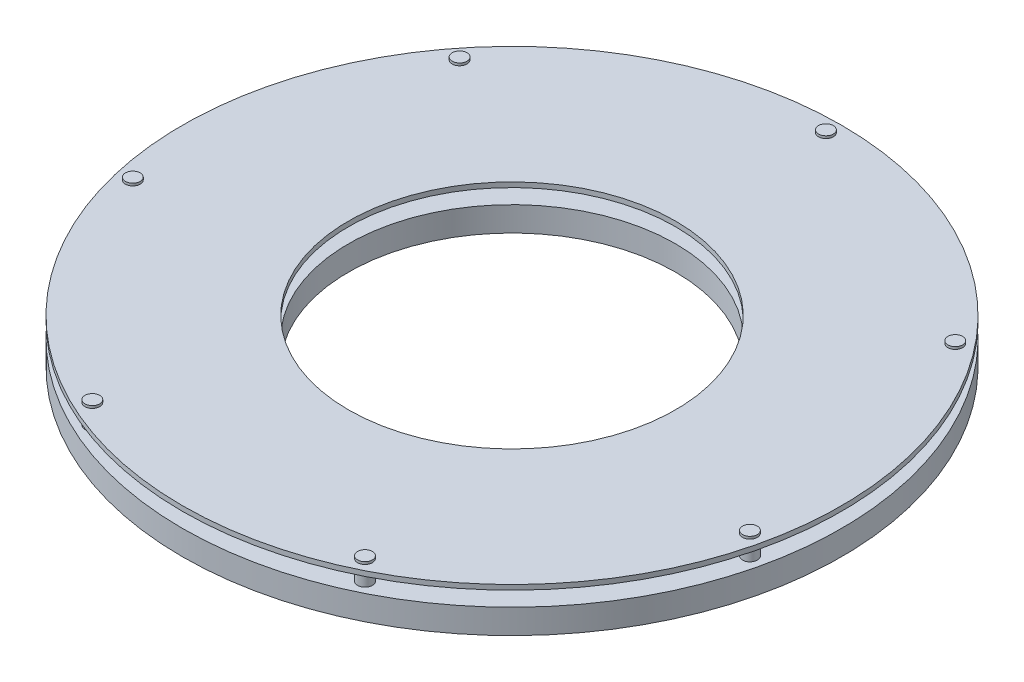
ISO-10303-21;
HEADER;
FILE_DESCRIPTION(('STEP AP214'),'2;1');
FILE_NAME('part.step','',(''),(''),'','','');
FILE_SCHEMA(('AUTOMOTIVE_DESIGN { 1 0 10303 214 1 1 1 1 }'));
ENDSEC;
DATA;
#1=APPLICATION_CONTEXT('core data for automotive mechanical design processes');
#2=APPLICATION_PROTOCOL_DEFINITION('international standard','automotive_design',2000,#1);
#3=PRODUCT_CONTEXT('',#1,'mechanical');
#4=PRODUCT('Part','Part','',(#3));
#5=PRODUCT_RELATED_PRODUCT_CATEGORY('part','',(#4));
#6=PRODUCT_DEFINITION_FORMATION('','',#4);
#7=PRODUCT_DEFINITION_CONTEXT('part definition',#1,'design');
#8=PRODUCT_DEFINITION('design','',#6,#7);
#9=PRODUCT_DEFINITION_SHAPE('','',#8);
#10=(LENGTH_UNIT() NAMED_UNIT(*) SI_UNIT(.MILLI.,.METRE.));
#11=(NAMED_UNIT(*) PLANE_ANGLE_UNIT() SI_UNIT($,.RADIAN.));
#12=(NAMED_UNIT(*) SI_UNIT($,.STERADIAN.) SOLID_ANGLE_UNIT());
#13=UNCERTAINTY_MEASURE_WITH_UNIT(LENGTH_MEASURE(1.E-05),#10,'distance_accuracy_value','');
#14=(GEOMETRIC_REPRESENTATION_CONTEXT(3) GLOBAL_UNCERTAINTY_ASSIGNED_CONTEXT((#13)) GLOBAL_UNIT_ASSIGNED_CONTEXT((#10,
#11,#12)) REPRESENTATION_CONTEXT('',''));
#15=CARTESIAN_POINT('',(0.,0.,0.));
#16=DIRECTION('',(0.,0.,1.));
#17=DIRECTION('',(1.,0.,0.));
#18=AXIS2_PLACEMENT_3D('',#15,#16,#17);
#19=CARTESIAN_POINT('',(0.,840.,-1425.));
#20=DIRECTION('',(0.,1.,0.));
#21=DIRECTION('',(0.,0.,1.));
#22=AXIS2_PLACEMENT_3D('',#19,#20,#21);
#23=PLANE('',#22);
#24=CARTESIAN_POINT('',(-273.430562276835,840.,-845.24425176375));
#25=DIRECTION('',(0.,1.,0.));
#26=DIRECTION('',(0.,0.,1.));
#27=AXIS2_PLACEMENT_3D('',#24,#25,#26);
#28=CIRCLE('',#27,15.);
#29=CARTESIAN_POINT('',(-273.430562276835,840.,-830.24425176375));
#30=VERTEX_POINT('',#29);
#31=EDGE_CURVE('E56',#30,#30,#28,.T.);
#32=ORIENTED_EDGE('',*,*,#31,.T.);
#33=EDGE_LOOP('',(#32));
#34=FACE_BOUND('',#33,.T.);
#35=CARTESIAN_POINT('',(-623.936104673147,840.,-1278.08254941873));
#36=DIRECTION('',(0.,1.,0.));
#37=DIRECTION('',(0.,0.,1.));
#38=AXIS2_PLACEMENT_3D('',#35,#36,#37);
#39=CIRCLE('',#38,15.);
#40=CARTESIAN_POINT('',(-623.936104673147,840.,-1263.08254941873));
#41=VERTEX_POINT('',#40);
#42=EDGE_CURVE('E65',#41,#41,#39,.T.);
#43=ORIENTED_EDGE('',*,*,#42,.T.);
#44=EDGE_LOOP('',(#43));
#45=FACE_BOUND('',#44,.T.);
#46=CARTESIAN_POINT('',(-503.388152694557,840.,-1821.83922150761));
#47=DIRECTION('',(0.,1.,0.));
#48=DIRECTION('',(0.,0.,1.));
#49=AXIS2_PLACEMENT_3D('',#46,#47,#48);
#50=CIRCLE('',#49,15.);
#51=CARTESIAN_POINT('',(-503.388152694557,840.,-1806.83922150761));
#52=VERTEX_POINT('',#51);
#53=EDGE_CURVE('E74',#52,#52,#50,.T.);
#54=ORIENTED_EDGE('',*,*,#53,.T.);
#55=EDGE_LOOP('',(#54));
#56=FACE_BOUND('',#55,.T.);
#57=CARTESIAN_POINT('',(-2.79688125152255,840.,-2065.99389814199));
#58=DIRECTION('',(0.,1.,0.));
#59=DIRECTION('',(0.,0.,1.));
#60=AXIS2_PLACEMENT_3D('',#57,#58,#59);
#61=CIRCLE('',#60,15.);
#62=CARTESIAN_POINT('',(-2.79688125152255,840.,-2050.99389814199));
#63=VERTEX_POINT('',#62);
#64=EDGE_CURVE('E83',#63,#63,#61,.T.);
#65=ORIENTED_EDGE('',*,*,#64,.T.);
#66=EDGE_LOOP('',(#65));
#67=FACE_BOUND('',#66,.T.);
#68=CARTESIAN_POINT('',(499.905953662537,840.,-1826.21694566998));
#69=DIRECTION('',(0.,1.,0.));
#70=DIRECTION('',(0.,0.,1.));
#71=AXIS2_PLACEMENT_3D('',#68,#69,#70);
#72=CIRCLE('',#71,15.);
#73=CARTESIAN_POINT('',(499.905953662537,840.,-1811.21694566998));
#74=VERTEX_POINT('',#73);
#75=EDGE_CURVE('E92',#74,#74,#72,.T.);
#76=ORIENTED_EDGE('',*,*,#75,.T.);
#77=EDGE_LOOP('',(#76));
#78=FACE_BOUND('',#77,.T.);
#79=CARTESIAN_POINT('',(625.194427445957,840.,-1283.53294415122));
#80=DIRECTION('',(0.,1.,0.));
#81=DIRECTION('',(0.,0.,1.));
#82=AXIS2_PLACEMENT_3D('',#79,#80,#81);
#83=CIRCLE('',#82,15.);
#84=CARTESIAN_POINT('',(625.194427445957,840.,-1268.53294415122));
#85=VERTEX_POINT('',#84);
#86=EDGE_CURVE('E101',#85,#85,#83,.T.);
#87=ORIENTED_EDGE('',*,*,#86,.T.);
#88=EDGE_LOOP('',(#87));
#89=FACE_BOUND('',#88,.T.);
#90=CARTESIAN_POINT('',(278.479409996231,840.,-847.652428594221));
#91=DIRECTION('',(0.,1.,0.));
#92=DIRECTION('',(0.,0.,1.));
#93=AXIS2_PLACEMENT_3D('',#90,#91,#92);
#94=CIRCLE('',#93,15.);
#95=CARTESIAN_POINT('',(278.479409996231,840.,-832.652428594221));
#96=VERTEX_POINT('',#95);
#97=EDGE_CURVE('E110',#96,#96,#94,.T.);
#98=ORIENTED_EDGE('',*,*,#97,.T.);
#99=EDGE_LOOP('',(#98));
#100=FACE_BOUND('',#99,.T.);
#101=CARTESIAN_POINT('',(0.,840.,-1425.));
#102=DIRECTION('',(0.,1.,0.));
#103=DIRECTION('',(0.,0.,1.));
#104=AXIS2_PLACEMENT_3D('',#101,#102,#103);
#105=CIRCLE('',#104,670.);
#106=CARTESIAN_POINT('',(-1.23072938559149E-13,840.,-755.));
#107=VERTEX_POINT('',#106);
#108=EDGE_CURVE('E120',#107,#107,#105,.T.);
#109=ORIENTED_EDGE('',*,*,#108,.F.);
#110=EDGE_LOOP('',(#109));
#111=FACE_BOUND('',#110,.T.);
#112=CARTESIAN_POINT('',(0.,840.,-1425.));
#113=DIRECTION('',(0.,1.,0.));
#114=DIRECTION('',(0.,0.,1.));
#115=AXIS2_PLACEMENT_3D('',#112,#113,#114);
#116=CIRCLE('',#115,332.5);
#117=CARTESIAN_POINT('',(0.,840.,-1092.5));
#118=VERTEX_POINT('',#117);
#119=EDGE_CURVE('E114',#118,#118,#116,.F.);
#120=ORIENTED_EDGE('',*,*,#119,.F.);
#121=EDGE_LOOP('',(#120));
#122=FACE_BOUND('',#121,.T.);
#123=ADVANCED_FACE('F15',(#34,#45,#56,#67,#78,#89,#100,#111,#122),#23,.F.);
#124=CARTESIAN_POINT('',(0.,850.,-1425.));
#125=DIRECTION('',(0.,1.,0.));
#126=DIRECTION('',(0.,0.,1.));
#127=AXIS2_PLACEMENT_3D('',#124,#125,#126);
#128=PLANE('',#127);
#129=CARTESIAN_POINT('',(-273.430562276835,850.,-845.24425176375));
#130=DIRECTION('',(0.,1.,0.));
#131=DIRECTION('',(0.,0.,1.));
#132=AXIS2_PLACEMENT_3D('',#129,#130,#131);
#133=CIRCLE('',#132,15.);
#134=CARTESIAN_POINT('',(-273.430562276835,850.,-830.24425176375));
#135=VERTEX_POINT('',#134);
#136=EDGE_CURVE('E143',#135,#135,#133,.T.);
#137=ORIENTED_EDGE('',*,*,#136,.F.);
#138=EDGE_LOOP('',(#137));
#139=FACE_BOUND('',#138,.T.);
#140=CARTESIAN_POINT('',(-623.936104673147,850.,-1278.08254941873));
#141=DIRECTION('',(0.,1.,0.));
#142=DIRECTION('',(0.,0.,1.));
#143=AXIS2_PLACEMENT_3D('',#140,#141,#142);
#144=CIRCLE('',#143,15.);
#145=CARTESIAN_POINT('',(-623.936104673147,850.,-1263.08254941873));
#146=VERTEX_POINT('',#145);
#147=EDGE_CURVE('E140',#146,#146,#144,.T.);
#148=ORIENTED_EDGE('',*,*,#147,.F.);
#149=EDGE_LOOP('',(#148));
#150=FACE_BOUND('',#149,.T.);
#151=CARTESIAN_POINT('',(-503.388152694557,850.,-1821.83922150761));
#152=DIRECTION('',(0.,1.,0.));
#153=DIRECTION('',(0.,0.,1.));
#154=AXIS2_PLACEMENT_3D('',#151,#152,#153);
#155=CIRCLE('',#154,15.);
#156=CARTESIAN_POINT('',(-503.388152694557,850.,-1806.83922150761));
#157=VERTEX_POINT('',#156);
#158=EDGE_CURVE('E137',#157,#157,#155,.T.);
#159=ORIENTED_EDGE('',*,*,#158,.F.);
#160=EDGE_LOOP('',(#159));
#161=FACE_BOUND('',#160,.T.);
#162=CARTESIAN_POINT('',(-2.79688125152254,850.,-2065.99389814199));
#163=DIRECTION('',(0.,1.,0.));
#164=DIRECTION('',(0.,0.,1.));
#165=AXIS2_PLACEMENT_3D('',#162,#163,#164);
#166=CIRCLE('',#165,15.);
#167=CARTESIAN_POINT('',(-2.79688125152254,850.,-2050.99389814199));
#168=VERTEX_POINT('',#167);
#169=EDGE_CURVE('E134',#168,#168,#166,.T.);
#170=ORIENTED_EDGE('',*,*,#169,.F.);
#171=EDGE_LOOP('',(#170));
#172=FACE_BOUND('',#171,.T.);
#173=CARTESIAN_POINT('',(499.905953662537,850.,-1826.21694566998));
#174=DIRECTION('',(0.,1.,0.));
#175=DIRECTION('',(0.,0.,1.));
#176=AXIS2_PLACEMENT_3D('',#173,#174,#175);
#177=CIRCLE('',#176,15.);
#178=CARTESIAN_POINT('',(499.905953662537,850.,-1811.21694566998));
#179=VERTEX_POINT('',#178);
#180=EDGE_CURVE('E131',#179,#179,#177,.T.);
#181=ORIENTED_EDGE('',*,*,#180,.F.);
#182=EDGE_LOOP('',(#181));
#183=FACE_BOUND('',#182,.T.);
#184=CARTESIAN_POINT('',(625.194427445957,850.,-1283.53294415122));
#185=DIRECTION('',(0.,1.,0.));
#186=DIRECTION('',(0.,0.,1.));
#187=AXIS2_PLACEMENT_3D('',#184,#185,#186);
#188=CIRCLE('',#187,15.);
#189=CARTESIAN_POINT('',(625.194427445957,850.,-1268.53294415122));
#190=VERTEX_POINT('',#189);
#191=EDGE_CURVE('E128',#190,#190,#188,.T.);
#192=ORIENTED_EDGE('',*,*,#191,.F.);
#193=EDGE_LOOP('',(#192));
#194=FACE_BOUND('',#193,.T.);
#195=CARTESIAN_POINT('',(278.479409996231,850.,-847.652428594221));
#196=DIRECTION('',(0.,1.,0.));
#197=DIRECTION('',(0.,0.,1.));
#198=AXIS2_PLACEMENT_3D('',#195,#196,#197);
#199=CIRCLE('',#198,15.);
#200=CARTESIAN_POINT('',(278.479409996231,850.,-832.652428594221));
#201=VERTEX_POINT('',#200);
#202=EDGE_CURVE('E123',#201,#201,#199,.T.);
#203=ORIENTED_EDGE('',*,*,#202,.F.);
#204=EDGE_LOOP('',(#203));
#205=FACE_BOUND('',#204,.T.);
#206=CARTESIAN_POINT('',(0.,850.,-1425.));
#207=DIRECTION('',(0.,1.,0.));
#208=DIRECTION('',(0.,0.,1.));
#209=AXIS2_PLACEMENT_3D('',#206,#207,#208);
#210=CIRCLE('',#209,670.);
#211=CARTESIAN_POINT('',(-1.23072938559149E-13,850.,-755.));
#212=VERTEX_POINT('',#211);
#213=EDGE_CURVE('E117',#212,#212,#210,.T.);
#214=ORIENTED_EDGE('',*,*,#213,.T.);
#215=EDGE_LOOP('',(#214));
#216=FACE_BOUND('',#215,.T.);
#217=CARTESIAN_POINT('',(0.,850.,-1425.));
#218=DIRECTION('',(0.,1.,0.));
#219=DIRECTION('',(0.,0.,1.));
#220=AXIS2_PLACEMENT_3D('',#217,#218,#219);
#221=CIRCLE('',#220,332.5);
#222=CARTESIAN_POINT('',(0.,850.,-1092.5));
#223=VERTEX_POINT('',#222);
#224=EDGE_CURVE('E113',#223,#223,#221,.F.);
#225=ORIENTED_EDGE('',*,*,#224,.T.);
#226=EDGE_LOOP('',(#225));
#227=FACE_BOUND('',#226,.T.);
#228=ADVANCED_FACE('F180',(#139,#150,#161,#172,#183,#194,#205,#216,#227),#128,.T.);
#229=CARTESIAN_POINT('',(0.,840.,-1425.));
#230=DIRECTION('',(0.,1.,0.));
#231=DIRECTION('',(0.,0.,1.));
#232=AXIS2_PLACEMENT_3D('',#229,#230,#231);
#233=CYLINDRICAL_SURFACE('',#232,670.);
#234=ORIENTED_EDGE('',*,*,#108,.T.);
#235=EDGE_LOOP('',(#234));
#236=FACE_BOUND('',#235,.T.);
#237=ORIENTED_EDGE('',*,*,#213,.F.);
#238=EDGE_LOOP('',(#237));
#239=FACE_BOUND('',#238,.T.);
#240=ADVANCED_FACE('F17',(#236,#239),#233,.T.);
#241=CARTESIAN_POINT('',(0.,4640.14511595532,-1425.));
#242=DIRECTION('',(0.,-1.,0.));
#243=DIRECTION('',(0.,0.,-1.));
#244=AXIS2_PLACEMENT_3D('',#241,#242,#243);
#245=CYLINDRICAL_SURFACE('',#244,332.5);
#246=ORIENTED_EDGE('',*,*,#224,.F.);
#247=EDGE_LOOP('',(#246));
#248=FACE_BOUND('',#247,.T.);
#249=ORIENTED_EDGE('',*,*,#119,.T.);
#250=EDGE_LOOP('',(#249));
#251=FACE_BOUND('',#250,.T.);
#252=ADVANCED_FACE('F190',(#248,#251),#245,.F.);
#253=CARTESIAN_POINT('',(278.479409996231,855.,-847.652428594221));
#254=DIRECTION('',(0.,1.,0.));
#255=DIRECTION('',(0.,0.,1.));
#256=AXIS2_PLACEMENT_3D('',#253,#254,#255);
#257=PLANE('',#256);
#258=CARTESIAN_POINT('',(278.479409996231,855.,-847.652428594221));
#259=DIRECTION('',(0.,1.,0.));
#260=DIRECTION('',(0.,0.,1.));
#261=AXIS2_PLACEMENT_3D('',#258,#259,#260);
#262=CIRCLE('',#261,15.);
#263=CARTESIAN_POINT('',(278.479409996231,855.,-832.652428594221));
#264=VERTEX_POINT('',#263);
#265=EDGE_CURVE('E104',#264,#264,#262,.T.);
#266=ORIENTED_EDGE('',*,*,#265,.T.);
#267=EDGE_LOOP('',(#266));
#268=FACE_BOUND('',#267,.T.);
#269=ADVANCED_FACE('F192',(#268),#257,.T.);
#270=CARTESIAN_POINT('',(278.479409996231,755.,-847.652428594221));
#271=DIRECTION('',(0.,1.,0.));
#272=DIRECTION('',(0.,0.,1.));
#273=AXIS2_PLACEMENT_3D('',#270,#271,#272);
#274=CYLINDRICAL_SURFACE('',#273,15.);
#275=ORIENTED_EDGE('',*,*,#202,.T.);
#276=EDGE_LOOP('',(#275));
#277=FACE_BOUND('',#276,.T.);
#278=ORIENTED_EDGE('',*,*,#265,.F.);
#279=EDGE_LOOP('',(#278));
#280=FACE_BOUND('',#279,.T.);
#281=ADVANCED_FACE('F200',(#277,#280),#274,.T.);
#282=CARTESIAN_POINT('',(278.479409996231,810.,-847.652428594221));
#283=DIRECTION('',(0.,1.,0.));
#284=DIRECTION('',(0.,0.,1.));
#285=AXIS2_PLACEMENT_3D('',#282,#283,#284);
#286=CIRCLE('',#285,15.);
#287=CARTESIAN_POINT('',(278.479409996231,810.,-832.652428594221));
#288=VERTEX_POINT('',#287);
#289=EDGE_CURVE('E10',#288,#288,#286,.F.);
#290=ORIENTED_EDGE('',*,*,#289,.F.);
#291=EDGE_LOOP('',(#290));
#292=FACE_BOUND('',#291,.T.);
#293=ORIENTED_EDGE('',*,*,#97,.F.);
#294=EDGE_LOOP('',(#293));
#295=FACE_BOUND('',#294,.T.);
#296=ADVANCED_FACE('F232',(#292,#295),#274,.T.);
#297=CARTESIAN_POINT('',(625.194427445957,855.,-1283.53294415122));
#298=DIRECTION('',(0.,1.,0.));
#299=DIRECTION('',(0.782608156852414,0.,0.62251463663762));
#300=AXIS2_PLACEMENT_3D('',#297,#298,#299);
#301=PLANE('',#300);
#302=CARTESIAN_POINT('',(625.194427445957,855.,-1283.53294415122));
#303=DIRECTION('',(0.,1.,0.));
#304=DIRECTION('',(0.782608156852414,0.,0.62251463663762));
#305=AXIS2_PLACEMENT_3D('',#302,#303,#304);
#306=CIRCLE('',#305,15.);
#307=CARTESIAN_POINT('',(636.933549798743,855.,-1274.19522460165));
#308=VERTEX_POINT('',#307);
#309=EDGE_CURVE('E95',#308,#308,#306,.T.);
#310=ORIENTED_EDGE('',*,*,#309,.T.);
#311=EDGE_LOOP('',(#310));
#312=FACE_BOUND('',#311,.T.);
#313=ADVANCED_FACE('F238',(#312),#301,.T.);
#314=CARTESIAN_POINT('',(625.194427445957,755.,-1283.53294415122));
#315=DIRECTION('',(0.,1.,0.));
#316=DIRECTION('',(0.782608156852414,0.,0.62251463663762));
#317=AXIS2_PLACEMENT_3D('',#314,#315,#316);
#318=CYLINDRICAL_SURFACE('',#317,15.);
#319=ORIENTED_EDGE('',*,*,#191,.T.);
#320=EDGE_LOOP('',(#319));
#321=FACE_BOUND('',#320,.T.);
#322=ORIENTED_EDGE('',*,*,#309,.F.);
#323=EDGE_LOOP('',(#322));
#324=FACE_BOUND('',#323,.T.);
#325=ADVANCED_FACE('F450',(#321,#324),#318,.T.);
#326=CARTESIAN_POINT('',(625.194427445957,810.,-1283.53294415122));
#327=DIRECTION('',(0.,1.,0.));
#328=DIRECTION('',(0.,0.,1.));
#329=AXIS2_PLACEMENT_3D('',#326,#327,#328);
#330=CIRCLE('',#329,15.);
#331=CARTESIAN_POINT('',(625.194427445957,810.,-1268.53294415122));
#332=VERTEX_POINT('',#331);
#333=EDGE_CURVE('E23',#332,#332,#330,.F.);
#334=ORIENTED_EDGE('',*,*,#333,.F.);
#335=EDGE_LOOP('',(#334));
#336=FACE_BOUND('',#335,.T.);
#337=ORIENTED_EDGE('',*,*,#86,.F.);
#338=EDGE_LOOP('',(#337));
#339=FACE_BOUND('',#338,.T.);
#340=ADVANCED_FACE('F449',(#336,#339),#318,.T.);
#341=CARTESIAN_POINT('',(499.905953662537,855.,-1826.21694566998));
#342=DIRECTION('',(0.,1.,0.));
#343=DIRECTION('',(0.974370064785235,0.,-0.224951054343865));
#344=AXIS2_PLACEMENT_3D('',#341,#342,#343);
#345=PLANE('',#344);
#346=CARTESIAN_POINT('',(499.905953662537,855.,-1826.21694566998));
#347=DIRECTION('',(0.,1.,0.));
#348=DIRECTION('',(0.974370064785235,0.,-0.224951054343865));
#349=AXIS2_PLACEMENT_3D('',#346,#347,#348);
#350=CIRCLE('',#349,15.);
#351=CARTESIAN_POINT('',(514.521504634316,855.,-1829.59121148514));
#352=VERTEX_POINT('',#351);
#353=EDGE_CURVE('E86',#352,#352,#350,.T.);
#354=ORIENTED_EDGE('',*,*,#353,.T.);
#355=EDGE_LOOP('',(#354));
#356=FACE_BOUND('',#355,.T.);
#357=ADVANCED_FACE('F465',(#356),#345,.T.);
#358=CARTESIAN_POINT('',(499.905953662537,755.,-1826.21694566998));
#359=DIRECTION('',(0.,1.,0.));
#360=DIRECTION('',(0.974370064785235,0.,-0.224951054343865));
#361=AXIS2_PLACEMENT_3D('',#358,#359,#360);
#362=CYLINDRICAL_SURFACE('',#361,15.);
#363=ORIENTED_EDGE('',*,*,#180,.T.);
#364=EDGE_LOOP('',(#363));
#365=FACE_BOUND('',#364,.T.);
#366=ORIENTED_EDGE('',*,*,#353,.F.);
#367=EDGE_LOOP('',(#366));
#368=FACE_BOUND('',#367,.T.);
#369=ADVANCED_FACE('F173',(#365,#368),#362,.T.);
#370=CARTESIAN_POINT('',(499.905953662537,810.,-1826.21694566998));
#371=DIRECTION('',(0.,1.,0.));
#372=DIRECTION('',(0.,0.,1.));
#373=AXIS2_PLACEMENT_3D('',#370,#371,#372);
#374=CIRCLE('',#373,15.);
#375=CARTESIAN_POINT('',(499.905953662537,810.,-1811.21694566998));
#376=VERTEX_POINT('',#375);
#377=EDGE_CURVE('E28',#376,#376,#374,.F.);
#378=ORIENTED_EDGE('',*,*,#377,.F.);
#379=EDGE_LOOP('',(#378));
#380=FACE_BOUND('',#379,.T.);
#381=ORIENTED_EDGE('',*,*,#75,.F.);
#382=EDGE_LOOP('',(#381));
#383=FACE_BOUND('',#382,.T.);
#384=ADVANCED_FACE('F169',(#380,#383),#362,.T.);
#385=CARTESIAN_POINT('',(-2.79688125152256,855.,-2065.99389814199));
#386=DIRECTION('',(0.,1.,0.));
#387=DIRECTION('',(0.430511096808295,0.,-0.902585284349861));
#388=AXIS2_PLACEMENT_3D('',#385,#386,#387);
#389=PLANE('',#388);
#390=CARTESIAN_POINT('',(-2.79688125152256,855.,-2065.99389814199));
#391=DIRECTION('',(0.,1.,0.));
#392=DIRECTION('',(0.430511096808295,0.,-0.902585284349861));
#393=AXIS2_PLACEMENT_3D('',#390,#391,#392);
#394=CIRCLE('',#393,15.);
#395=CARTESIAN_POINT('',(3.66078520060187,855.,-2079.53267740724));
#396=VERTEX_POINT('',#395);
#397=EDGE_CURVE('E77',#396,#396,#394,.T.);
#398=ORIENTED_EDGE('',*,*,#397,.T.);
#399=EDGE_LOOP('',(#398));
#400=FACE_BOUND('',#399,.T.);
#401=ADVANCED_FACE('F172',(#400),#389,.T.);
#402=CARTESIAN_POINT('',(-2.79688125152256,755.,-2065.99389814199));
#403=DIRECTION('',(0.,1.,0.));
#404=DIRECTION('',(0.430511096808295,0.,-0.902585284349861));
#405=AXIS2_PLACEMENT_3D('',#402,#403,#404);
#406=CYLINDRICAL_SURFACE('',#405,15.);
#407=ORIENTED_EDGE('',*,*,#169,.T.);
#408=EDGE_LOOP('',(#407));
#409=FACE_BOUND('',#408,.T.);
#410=ORIENTED_EDGE('',*,*,#397,.F.);
#411=EDGE_LOOP('',(#410));
#412=FACE_BOUND('',#411,.T.);
#413=ADVANCED_FACE('F412',(#409,#412),#406,.T.);
#414=CARTESIAN_POINT('',(-2.79688125152255,810.,-2065.99389814199));
#415=DIRECTION('',(0.,1.,0.));
#416=DIRECTION('',(0.,0.,1.));
#417=AXIS2_PLACEMENT_3D('',#414,#415,#416);
#418=CIRCLE('',#417,15.);
#419=CARTESIAN_POINT('',(-2.79688125152255,810.,-2050.99389814199));
#420=VERTEX_POINT('',#419);
#421=EDGE_CURVE('E156',#420,#420,#418,.F.);
#422=ORIENTED_EDGE('',*,*,#421,.F.);
#423=EDGE_LOOP('',(#422));
#424=FACE_BOUND('',#423,.T.);
#425=ORIENTED_EDGE('',*,*,#64,.F.);
#426=EDGE_LOOP('',(#425));
#427=FACE_BOUND('',#426,.T.);
#428=ADVANCED_FACE('F411',(#424,#427),#406,.T.);
#429=CARTESIAN_POINT('',(-503.388152694557,855.,-1821.83922150761));
#430=DIRECTION('',(0.,1.,0.));
#431=DIRECTION('',(-0.438371146789078,0.,-0.898794046299167));
#432=AXIS2_PLACEMENT_3D('',#429,#430,#431);
#433=PLANE('',#432);
#434=CARTESIAN_POINT('',(-503.388152694557,855.,-1821.83922150761));
#435=DIRECTION('',(0.,1.,0.));
#436=DIRECTION('',(-0.438371146789078,0.,-0.898794046299167));
#437=AXIS2_PLACEMENT_3D('',#434,#435,#436);
#438=CIRCLE('',#437,15.);
#439=CARTESIAN_POINT('',(-509.963719896393,855.,-1835.32113220209));
#440=VERTEX_POINT('',#439);
#441=EDGE_CURVE('E68',#440,#440,#438,.T.);
#442=ORIENTED_EDGE('',*,*,#441,.T.);
#443=EDGE_LOOP('',(#442));
#444=FACE_BOUND('',#443,.T.);
#445=ADVANCED_FACE('F489',(#444),#433,.T.);
#446=CARTESIAN_POINT('',(-503.388152694557,755.,-1821.83922150761));
#447=DIRECTION('',(0.,1.,0.));
#448=DIRECTION('',(-0.438371146789078,0.,-0.898794046299167));
#449=AXIS2_PLACEMENT_3D('',#446,#447,#448);
#450=CYLINDRICAL_SURFACE('',#449,15.);
#451=ORIENTED_EDGE('',*,*,#158,.T.);
#452=EDGE_LOOP('',(#451));
#453=FACE_BOUND('',#452,.T.);
#454=ORIENTED_EDGE('',*,*,#441,.F.);
#455=EDGE_LOOP('',(#454));
#456=FACE_BOUND('',#455,.T.);
#457=ADVANCED_FACE('F390',(#453,#456),#450,.T.);
#458=CARTESIAN_POINT('',(-503.388152694557,810.,-1821.83922150761));
#459=DIRECTION('',(0.,1.,0.));
#460=DIRECTION('',(0.,0.,1.));
#461=AXIS2_PLACEMENT_3D('',#458,#459,#460);
#462=CIRCLE('',#461,15.);
#463=CARTESIAN_POINT('',(-503.388152694557,810.,-1806.83922150761));
#464=VERTEX_POINT('',#463);
#465=EDGE_CURVE('E151',#464,#464,#462,.F.);
#466=ORIENTED_EDGE('',*,*,#465,.F.);
#467=EDGE_LOOP('',(#466));
#468=FACE_BOUND('',#467,.T.);
#469=ORIENTED_EDGE('',*,*,#53,.F.);
#470=EDGE_LOOP('',(#469));
#471=FACE_BOUND('',#470,.T.);
#472=ADVANCED_FACE('F389',(#468,#471),#450,.T.);
#473=CARTESIAN_POINT('',(-623.936104673147,855.,-1278.08254941873));
#474=DIRECTION('',(0.,1.,0.));
#475=DIRECTION('',(-0.976296007119933,0.,-0.216439613938103));
#476=AXIS2_PLACEMENT_3D('',#473,#474,#475);
#477=PLANE('',#476);
#478=CARTESIAN_POINT('',(-623.936104673147,855.,-1278.08254941873));
#479=DIRECTION('',(0.,1.,0.));
#480=DIRECTION('',(-0.976296007119933,0.,-0.216439613938103));
#481=AXIS2_PLACEMENT_3D('',#478,#479,#480);
#482=CIRCLE('',#481,15.);
#483=CARTESIAN_POINT('',(-638.580544779946,855.,-1281.3291436278));
#484=VERTEX_POINT('',#483);
#485=EDGE_CURVE('E59',#484,#484,#482,.T.);
#486=ORIENTED_EDGE('',*,*,#485,.T.);
#487=EDGE_LOOP('',(#486));
#488=FACE_BOUND('',#487,.T.);
#489=ADVANCED_FACE('F495',(#488),#477,.T.);
#490=CARTESIAN_POINT('',(-623.936104673147,755.,-1278.08254941873));
#491=DIRECTION('',(0.,1.,0.));
#492=DIRECTION('',(-0.976296007119933,0.,-0.216439613938103));
#493=AXIS2_PLACEMENT_3D('',#490,#491,#492);
#494=CYLINDRICAL_SURFACE('',#493,15.);
#495=ORIENTED_EDGE('',*,*,#147,.T.);
#496=EDGE_LOOP('',(#495));
#497=FACE_BOUND('',#496,.T.);
#498=ORIENTED_EDGE('',*,*,#485,.F.);
#499=EDGE_LOOP('',(#498));
#500=FACE_BOUND('',#499,.T.);
#501=ADVANCED_FACE('F319',(#497,#500),#494,.T.);
#502=CARTESIAN_POINT('',(-623.936104673147,810.,-1278.08254941873));
#503=DIRECTION('',(0.,1.,0.));
#504=DIRECTION('',(0.,0.,1.));
#505=AXIS2_PLACEMENT_3D('',#502,#503,#504);
#506=CIRCLE('',#505,15.);
#507=CARTESIAN_POINT('',(-623.936104673147,810.,-1263.08254941873));
#508=VERTEX_POINT('',#507);
#509=EDGE_CURVE('E147',#508,#508,#506,.F.);
#510=ORIENTED_EDGE('',*,*,#509,.F.);
#511=EDGE_LOOP('',(#510));
#512=FACE_BOUND('',#511,.T.);
#513=ORIENTED_EDGE('',*,*,#42,.F.);
#514=EDGE_LOOP('',(#513));
#515=FACE_BOUND('',#514,.T.);
#516=ADVANCED_FACE('F311',(#512,#515),#494,.T.);
#517=CARTESIAN_POINT('',(-273.430562276835,855.,-845.244251763751));
#518=DIRECTION('',(0.,1.,0.));
#519=DIRECTION('',(-0.777145961456971,0.,0.629320391049838));
#520=AXIS2_PLACEMENT_3D('',#517,#518,#519);
#521=PLANE('',#520);
#522=CARTESIAN_POINT('',(-273.430562276835,855.,-845.244251763751));
#523=DIRECTION('',(0.,1.,0.));
#524=DIRECTION('',(-0.777145961456971,0.,0.629320391049838));
#525=AXIS2_PLACEMENT_3D('',#522,#523,#524);
#526=CIRCLE('',#525,15.);
#527=CARTESIAN_POINT('',(-285.087751698689,855.,-835.804445898003));
#528=VERTEX_POINT('',#527);
#529=EDGE_CURVE('E50',#528,#528,#526,.T.);
#530=ORIENTED_EDGE('',*,*,#529,.T.);
#531=EDGE_LOOP('',(#530));
#532=FACE_BOUND('',#531,.T.);
#533=ADVANCED_FACE('F306',(#532),#521,.T.);
#534=CARTESIAN_POINT('',(-273.430562276835,755.,-845.24425176375));
#535=DIRECTION('',(0.,1.,0.));
#536=DIRECTION('',(-0.777145961456971,0.,0.629320391049838));
#537=AXIS2_PLACEMENT_3D('',#534,#535,#536);
#538=CYLINDRICAL_SURFACE('',#537,15.);
#539=ORIENTED_EDGE('',*,*,#136,.T.);
#540=EDGE_LOOP('',(#539));
#541=FACE_BOUND('',#540,.T.);
#542=ORIENTED_EDGE('',*,*,#529,.F.);
#543=EDGE_LOOP('',(#542));
#544=FACE_BOUND('',#543,.T.);
#545=ADVANCED_FACE('F291',(#541,#544),#538,.T.);
#546=CARTESIAN_POINT('',(-273.430562276835,810.,-845.24425176375));
#547=DIRECTION('',(0.,1.,0.));
#548=DIRECTION('',(0.,0.,1.));
#549=AXIS2_PLACEMENT_3D('',#546,#547,#548);
#550=CIRCLE('',#549,15.);
#551=CARTESIAN_POINT('',(-273.430562276835,810.,-830.24425176375));
#552=VERTEX_POINT('',#551);
#553=EDGE_CURVE('E145',#552,#552,#550,.F.);
#554=ORIENTED_EDGE('',*,*,#553,.F.);
#555=EDGE_LOOP('',(#554));
#556=FACE_BOUND('',#555,.T.);
#557=ORIENTED_EDGE('',*,*,#31,.F.);
#558=EDGE_LOOP('',(#557));
#559=FACE_BOUND('',#558,.T.);
#560=ADVANCED_FACE('F255',(#556,#559),#538,.T.);
#561=CARTESIAN_POINT('',(0.,760.,-1425.));
#562=DIRECTION('',(0.,1.,0.));
#563=DIRECTION('',(0.,0.,1.));
#564=AXIS2_PLACEMENT_3D('',#561,#562,#563);
#565=PLANE('',#564);
#566=CARTESIAN_POINT('',(278.479409996231,760.,-847.652428594221));
#567=DIRECTION('',(0.,1.,0.));
#568=DIRECTION('',(0.,0.,1.));
#569=AXIS2_PLACEMENT_3D('',#566,#567,#568);
#570=CIRCLE('',#569,15.);
#571=CARTESIAN_POINT('',(278.479409996231,760.,-832.652428594221));
#572=VERTEX_POINT('',#571);
#573=EDGE_CURVE('E47',#572,#572,#570,.F.);
#574=ORIENTED_EDGE('',*,*,#573,.F.);
#575=EDGE_LOOP('',(#574));
#576=FACE_BOUND('',#575,.T.);
#577=CARTESIAN_POINT('',(625.194427445957,760.,-1283.53294415122));
#578=DIRECTION('',(0.,1.,0.));
#579=DIRECTION('',(0.,0.,1.));
#580=AXIS2_PLACEMENT_3D('',#577,#578,#579);
#581=CIRCLE('',#580,15.);
#582=CARTESIAN_POINT('',(625.194427445957,760.,-1268.53294415122));
#583=VERTEX_POINT('',#582);
#584=EDGE_CURVE('E44',#583,#583,#581,.F.);
#585=ORIENTED_EDGE('',*,*,#584,.F.);
#586=EDGE_LOOP('',(#585));
#587=FACE_BOUND('',#586,.T.);
#588=CARTESIAN_POINT('',(499.905953662537,760.,-1826.21694566998));
#589=DIRECTION('',(0.,1.,0.));
#590=DIRECTION('',(0.,0.,1.));
#591=AXIS2_PLACEMENT_3D('',#588,#589,#590);
#592=CIRCLE('',#591,15.);
#593=CARTESIAN_POINT('',(499.905953662537,760.,-1811.21694566998));
#594=VERTEX_POINT('',#593);
#595=EDGE_CURVE('E41',#594,#594,#592,.F.);
#596=ORIENTED_EDGE('',*,*,#595,.F.);
#597=EDGE_LOOP('',(#596));
#598=FACE_BOUND('',#597,.T.);
#599=CARTESIAN_POINT('',(-2.79688125152256,760.,-2065.99389814199));
#600=DIRECTION('',(0.,1.,0.));
#601=DIRECTION('',(0.,0.,1.));
#602=AXIS2_PLACEMENT_3D('',#599,#600,#601);
#603=CIRCLE('',#602,15.);
#604=CARTESIAN_POINT('',(-2.79688125152256,760.,-2050.99389814199));
#605=VERTEX_POINT('',#604);
#606=EDGE_CURVE('E38',#605,#605,#603,.F.);
#607=ORIENTED_EDGE('',*,*,#606,.F.);
#608=EDGE_LOOP('',(#607));
#609=FACE_BOUND('',#608,.T.);
#610=CARTESIAN_POINT('',(-503.388152694557,760.,-1821.83922150761));
#611=DIRECTION('',(0.,1.,0.));
#612=DIRECTION('',(0.,0.,1.));
#613=AXIS2_PLACEMENT_3D('',#610,#611,#612);
#614=CIRCLE('',#613,15.);
#615=CARTESIAN_POINT('',(-503.388152694557,760.,-1806.83922150761));
#616=VERTEX_POINT('',#615);
#617=EDGE_CURVE('E35',#616,#616,#614,.F.);
#618=ORIENTED_EDGE('',*,*,#617,.F.);
#619=EDGE_LOOP('',(#618));
#620=FACE_BOUND('',#619,.T.);
#621=CARTESIAN_POINT('',(-623.936104673147,760.,-1278.08254941873));
#622=DIRECTION('',(0.,1.,0.));
#623=DIRECTION('',(0.,0.,1.));
#624=AXIS2_PLACEMENT_3D('',#621,#622,#623);
#625=CIRCLE('',#624,15.);
#626=CARTESIAN_POINT('',(-623.936104673147,760.,-1263.08254941873));
#627=VERTEX_POINT('',#626);
#628=EDGE_CURVE('E32',#627,#627,#625,.F.);
#629=ORIENTED_EDGE('',*,*,#628,.F.);
#630=EDGE_LOOP('',(#629));
#631=FACE_BOUND('',#630,.T.);
#632=CARTESIAN_POINT('',(-273.430562276835,760.,-845.24425176375));
#633=DIRECTION('',(0.,1.,0.));
#634=DIRECTION('',(0.,0.,1.));
#635=AXIS2_PLACEMENT_3D('',#632,#633,#634);
#636=CIRCLE('',#635,15.);
#637=CARTESIAN_POINT('',(-273.430562276835,760.,-830.24425176375));
#638=VERTEX_POINT('',#637);
#639=EDGE_CURVE('E19',#638,#638,#636,.F.);
#640=ORIENTED_EDGE('',*,*,#639,.F.);
#641=EDGE_LOOP('',(#640));
#642=FACE_BOUND('',#641,.T.);
#643=CARTESIAN_POINT('',(0.,760.,-1425.));
#644=DIRECTION('',(0.,1.,0.));
#645=DIRECTION('',(0.,0.,1.));
#646=AXIS2_PLACEMENT_3D('',#643,#644,#645);
#647=CIRCLE('',#646,670.);
#648=CARTESIAN_POINT('',(-1.23072938559149E-13,760.,-755.));
#649=VERTEX_POINT('',#648);
#650=EDGE_CURVE('E273',#649,#649,#647,.T.);
#651=ORIENTED_EDGE('',*,*,#650,.F.);
#652=EDGE_LOOP('',(#651));
#653=FACE_BOUND('',#652,.T.);
#654=CARTESIAN_POINT('',(0.,760.,-1425.));
#655=DIRECTION('',(0.,1.,0.));
#656=DIRECTION('',(0.,0.,1.));
#657=AXIS2_PLACEMENT_3D('',#654,#655,#656);
#658=CIRCLE('',#657,332.5);
#659=CARTESIAN_POINT('',(0.,760.,-1092.5));
#660=VERTEX_POINT('',#659);
#661=EDGE_CURVE('E276',#660,#660,#658,.F.);
#662=ORIENTED_EDGE('',*,*,#661,.F.);
#663=EDGE_LOOP('',(#662));
#664=FACE_BOUND('',#663,.T.);
#665=ADVANCED_FACE('F252',(#576,#587,#598,#609,#620,#631,#642,#653,#664),#565,.F.);
#666=CARTESIAN_POINT('',(0.,810.,-1425.));
#667=DIRECTION('',(0.,1.,0.));
#668=DIRECTION('',(0.,0.,1.));
#669=AXIS2_PLACEMENT_3D('',#666,#667,#668);
#670=PLANE('',#669);
#671=ORIENTED_EDGE('',*,*,#289,.T.);
#672=EDGE_LOOP('',(#671));
#673=FACE_BOUND('',#672,.T.);
#674=ORIENTED_EDGE('',*,*,#333,.T.);
#675=EDGE_LOOP('',(#674));
#676=FACE_BOUND('',#675,.T.);
#677=ORIENTED_EDGE('',*,*,#377,.T.);
#678=EDGE_LOOP('',(#677));
#679=FACE_BOUND('',#678,.T.);
#680=ORIENTED_EDGE('',*,*,#421,.T.);
#681=EDGE_LOOP('',(#680));
#682=FACE_BOUND('',#681,.T.);
#683=ORIENTED_EDGE('',*,*,#465,.T.);
#684=EDGE_LOOP('',(#683));
#685=FACE_BOUND('',#684,.T.);
#686=ORIENTED_EDGE('',*,*,#509,.T.);
#687=EDGE_LOOP('',(#686));
#688=FACE_BOUND('',#687,.T.);
#689=ORIENTED_EDGE('',*,*,#553,.T.);
#690=EDGE_LOOP('',(#689));
#691=FACE_BOUND('',#690,.T.);
#692=CARTESIAN_POINT('',(0.,810.,-1425.));
#693=DIRECTION('',(0.,1.,0.));
#694=DIRECTION('',(0.,0.,1.));
#695=AXIS2_PLACEMENT_3D('',#692,#693,#694);
#696=CIRCLE('',#695,670.);
#697=CARTESIAN_POINT('',(-1.23072938559149E-13,810.,-755.));
#698=VERTEX_POINT('',#697);
#699=EDGE_CURVE('E278',#698,#698,#696,.T.);
#700=ORIENTED_EDGE('',*,*,#699,.T.);
#701=EDGE_LOOP('',(#700));
#702=FACE_BOUND('',#701,.T.);
#703=CARTESIAN_POINT('',(0.,810.,-1425.));
#704=DIRECTION('',(0.,1.,0.));
#705=DIRECTION('',(0.,0.,1.));
#706=AXIS2_PLACEMENT_3D('',#703,#704,#705);
#707=CIRCLE('',#706,332.5);
#708=CARTESIAN_POINT('',(0.,810.,-1092.5));
#709=VERTEX_POINT('',#708);
#710=EDGE_CURVE('E159',#709,#709,#707,.F.);
#711=ORIENTED_EDGE('',*,*,#710,.T.);
#712=EDGE_LOOP('',(#711));
#713=FACE_BOUND('',#712,.T.);
#714=ADVANCED_FACE('F166',(#673,#676,#679,#682,#685,#688,#691,#702,#713),#670,.T.);
#715=CARTESIAN_POINT('',(0.,760.,-1425.));
#716=DIRECTION('',(0.,1.,0.));
#717=DIRECTION('',(0.,0.,1.));
#718=AXIS2_PLACEMENT_3D('',#715,#716,#717);
#719=CYLINDRICAL_SURFACE('',#718,670.);
#720=ORIENTED_EDGE('',*,*,#650,.T.);
#721=EDGE_LOOP('',(#720));
#722=FACE_BOUND('',#721,.T.);
#723=ORIENTED_EDGE('',*,*,#699,.F.);
#724=EDGE_LOOP('',(#723));
#725=FACE_BOUND('',#724,.T.);
#726=ADVANCED_FACE('F323',(#722,#725),#719,.T.);
#727=CARTESIAN_POINT('',(0.,4601.4113467151,-1425.));
#728=DIRECTION('',(0.,-1.,0.));
#729=DIRECTION('',(0.,0.,-1.));
#730=AXIS2_PLACEMENT_3D('',#727,#728,#729);
#731=CYLINDRICAL_SURFACE('',#730,332.5);
#732=ORIENTED_EDGE('',*,*,#710,.F.);
#733=EDGE_LOOP('',(#732));
#734=FACE_BOUND('',#733,.T.);
#735=ORIENTED_EDGE('',*,*,#661,.T.);
#736=EDGE_LOOP('',(#735));
#737=FACE_BOUND('',#736,.T.);
#738=ADVANCED_FACE('F299',(#734,#737),#731,.F.);
#739=CARTESIAN_POINT('',(-273.430562276835,755.,-845.24425176375));
#740=DIRECTION('',(0.,1.,0.));
#741=DIRECTION('',(-0.777145961456971,0.,0.629320391049838));
#742=AXIS2_PLACEMENT_3D('',#739,#740,#741);
#743=PLANE('',#742);
#744=CARTESIAN_POINT('',(-273.430562276835,755.,-845.24425176375));
#745=DIRECTION('',(0.,1.,0.));
#746=DIRECTION('',(-0.777145961456971,0.,0.629320391049838));
#747=AXIS2_PLACEMENT_3D('',#744,#745,#746);
#748=CIRCLE('',#747,15.);
#749=CARTESIAN_POINT('',(-285.087751698689,755.,-835.804445898002));
#750=VERTEX_POINT('',#749);
#751=EDGE_CURVE('E53',#750,#750,#748,.T.);
#752=ORIENTED_EDGE('',*,*,#751,.F.);
#753=EDGE_LOOP('',(#752));
#754=FACE_BOUND('',#753,.T.);
#755=ADVANCED_FACE('F288',(#754),#743,.F.);
#756=ORIENTED_EDGE('',*,*,#751,.T.);
#757=EDGE_LOOP('',(#756));
#758=FACE_BOUND('',#757,.T.);
#759=ORIENTED_EDGE('',*,*,#639,.T.);
#760=EDGE_LOOP('',(#759));
#761=FACE_BOUND('',#760,.T.);
#762=ADVANCED_FACE('F285',(#758,#761),#538,.T.);
#763=CARTESIAN_POINT('',(-623.936104673147,755.,-1278.08254941873));
#764=DIRECTION('',(0.,1.,0.));
#765=DIRECTION('',(-0.976296007119933,0.,-0.216439613938103));
#766=AXIS2_PLACEMENT_3D('',#763,#764,#765);
#767=PLANE('',#766);
#768=CARTESIAN_POINT('',(-623.936104673147,755.,-1278.08254941873));
#769=DIRECTION('',(0.,1.,0.));
#770=DIRECTION('',(-0.976296007119933,0.,-0.216439613938103));
#771=AXIS2_PLACEMENT_3D('',#768,#769,#770);
#772=CIRCLE('',#771,15.);
#773=CARTESIAN_POINT('',(-638.580544779946,755.,-1281.3291436278));
#774=VERTEX_POINT('',#773);
#775=EDGE_CURVE('E62',#774,#774,#772,.T.);
#776=ORIENTED_EDGE('',*,*,#775,.F.);
#777=EDGE_LOOP('',(#776));
#778=FACE_BOUND('',#777,.T.);
#779=ADVANCED_FACE('F287',(#778),#767,.F.);
#780=ORIENTED_EDGE('',*,*,#775,.T.);
#781=EDGE_LOOP('',(#780));
#782=FACE_BOUND('',#781,.T.);
#783=ORIENTED_EDGE('',*,*,#628,.T.);
#784=EDGE_LOOP('',(#783));
#785=FACE_BOUND('',#784,.T.);
#786=ADVANCED_FACE('F296',(#782,#785),#494,.T.);
#787=CARTESIAN_POINT('',(-503.388152694557,755.,-1821.83922150761));
#788=DIRECTION('',(0.,1.,0.));
#789=DIRECTION('',(-0.438371146789078,0.,-0.898794046299167));
#790=AXIS2_PLACEMENT_3D('',#787,#788,#789);
#791=PLANE('',#790);
#792=CARTESIAN_POINT('',(-503.388152694557,755.,-1821.83922150761));
#793=DIRECTION('',(0.,1.,0.));
#794=DIRECTION('',(-0.438371146789078,0.,-0.898794046299167));
#795=AXIS2_PLACEMENT_3D('',#792,#793,#794);
#796=CIRCLE('',#795,15.);
#797=CARTESIAN_POINT('',(-509.963719896393,755.,-1835.32113220209));
#798=VERTEX_POINT('',#797);
#799=EDGE_CURVE('E71',#798,#798,#796,.T.);
#800=ORIENTED_EDGE('',*,*,#799,.F.);
#801=EDGE_LOOP('',(#800));
#802=FACE_BOUND('',#801,.T.);
#803=ADVANCED_FACE('F367',(#802),#791,.F.);
#804=ORIENTED_EDGE('',*,*,#799,.T.);
#805=EDGE_LOOP('',(#804));
#806=FACE_BOUND('',#805,.T.);
#807=ORIENTED_EDGE('',*,*,#617,.T.);
#808=EDGE_LOOP('',(#807));
#809=FACE_BOUND('',#808,.T.);
#810=ADVANCED_FACE('F376',(#806,#809),#450,.T.);
#811=CARTESIAN_POINT('',(-2.79688125152256,755.,-2065.99389814199));
#812=DIRECTION('',(0.,1.,0.));
#813=DIRECTION('',(0.430511096808295,0.,-0.902585284349861));
#814=AXIS2_PLACEMENT_3D('',#811,#812,#813);
#815=PLANE('',#814);
#816=CARTESIAN_POINT('',(-2.79688125152256,755.,-2065.99389814199));
#817=DIRECTION('',(0.,1.,0.));
#818=DIRECTION('',(0.430511096808295,0.,-0.902585284349861));
#819=AXIS2_PLACEMENT_3D('',#816,#817,#818);
#820=CIRCLE('',#819,15.);
#821=CARTESIAN_POINT('',(3.66078520060187,755.,-2079.53267740724));
#822=VERTEX_POINT('',#821);
#823=EDGE_CURVE('E80',#822,#822,#820,.T.);
#824=ORIENTED_EDGE('',*,*,#823,.F.);
#825=EDGE_LOOP('',(#824));
#826=FACE_BOUND('',#825,.T.);
#827=ADVANCED_FACE('F386',(#826),#815,.F.);
#828=ORIENTED_EDGE('',*,*,#823,.T.);
#829=EDGE_LOOP('',(#828));
#830=FACE_BOUND('',#829,.T.);
#831=ORIENTED_EDGE('',*,*,#606,.T.);
#832=EDGE_LOOP('',(#831));
#833=FACE_BOUND('',#832,.T.);
#834=ADVANCED_FACE('F398',(#830,#833),#406,.T.);
#835=CARTESIAN_POINT('',(499.905953662537,755.,-1826.21694566998));
#836=DIRECTION('',(0.,1.,0.));
#837=DIRECTION('',(0.974370064785235,0.,-0.224951054343865));
#838=AXIS2_PLACEMENT_3D('',#835,#836,#837);
#839=PLANE('',#838);
#840=CARTESIAN_POINT('',(499.905953662537,755.,-1826.21694566998));
#841=DIRECTION('',(0.,1.,0.));
#842=DIRECTION('',(0.974370064785235,0.,-0.224951054343865));
#843=AXIS2_PLACEMENT_3D('',#840,#841,#842);
#844=CIRCLE('',#843,15.);
#845=CARTESIAN_POINT('',(514.521504634316,755.,-1829.59121148514));
#846=VERTEX_POINT('',#845);
#847=EDGE_CURVE('E89',#846,#846,#844,.T.);
#848=ORIENTED_EDGE('',*,*,#847,.F.);
#849=EDGE_LOOP('',(#848));
#850=FACE_BOUND('',#849,.T.);
#851=ADVANCED_FACE('F408',(#850),#839,.F.);
#852=ORIENTED_EDGE('',*,*,#847,.T.);
#853=EDGE_LOOP('',(#852));
#854=FACE_BOUND('',#853,.T.);
#855=ORIENTED_EDGE('',*,*,#595,.T.);
#856=EDGE_LOOP('',(#855));
#857=FACE_BOUND('',#856,.T.);
#858=ADVANCED_FACE('F175',(#854,#857),#362,.T.);
#859=CARTESIAN_POINT('',(625.194427445957,755.,-1283.53294415122));
#860=DIRECTION('',(0.,1.,0.));
#861=DIRECTION('',(0.782608156852414,0.,0.62251463663762));
#862=AXIS2_PLACEMENT_3D('',#859,#860,#861);
#863=PLANE('',#862);
#864=CARTESIAN_POINT('',(625.194427445957,755.,-1283.53294415122));
#865=DIRECTION('',(0.,1.,0.));
#866=DIRECTION('',(0.782608156852414,0.,0.62251463663762));
#867=AXIS2_PLACEMENT_3D('',#864,#865,#866);
#868=CIRCLE('',#867,15.);
#869=CARTESIAN_POINT('',(636.933549798743,755.,-1274.19522460165));
#870=VERTEX_POINT('',#869);
#871=EDGE_CURVE('E98',#870,#870,#868,.T.);
#872=ORIENTED_EDGE('',*,*,#871,.F.);
#873=EDGE_LOOP('',(#872));
#874=FACE_BOUND('',#873,.T.);
#875=ADVANCED_FACE('F429',(#874),#863,.F.);
#876=ORIENTED_EDGE('',*,*,#871,.T.);
#877=EDGE_LOOP('',(#876));
#878=FACE_BOUND('',#877,.T.);
#879=ORIENTED_EDGE('',*,*,#584,.T.);
#880=EDGE_LOOP('',(#879));
#881=FACE_BOUND('',#880,.T.);
#882=ADVANCED_FACE('F246',(#878,#881),#318,.T.);
#883=CARTESIAN_POINT('',(278.479409996231,755.,-847.652428594221));
#884=DIRECTION('',(0.,1.,0.));
#885=DIRECTION('',(0.,0.,1.));
#886=AXIS2_PLACEMENT_3D('',#883,#884,#885);
#887=PLANE('',#886);
#888=CARTESIAN_POINT('',(278.479409996231,755.,-847.652428594221));
#889=DIRECTION('',(0.,1.,0.));
#890=DIRECTION('',(0.,0.,1.));
#891=AXIS2_PLACEMENT_3D('',#888,#889,#890);
#892=CIRCLE('',#891,15.);
#893=CARTESIAN_POINT('',(278.479409996231,755.,-832.652428594221));
#894=VERTEX_POINT('',#893);
#895=EDGE_CURVE('E107',#894,#894,#892,.T.);
#896=ORIENTED_EDGE('',*,*,#895,.F.);
#897=EDGE_LOOP('',(#896));
#898=FACE_BOUND('',#897,.T.);
#899=ADVANCED_FACE('F241',(#898),#887,.F.);
#900=ORIENTED_EDGE('',*,*,#895,.T.);
#901=EDGE_LOOP('',(#900));
#902=FACE_BOUND('',#901,.T.);
#903=ORIENTED_EDGE('',*,*,#573,.T.);
#904=EDGE_LOOP('',(#903));
#905=FACE_BOUND('',#904,.T.);
#906=ADVANCED_FACE('F233',(#902,#905),#274,.T.);
#907=CLOSED_SHELL('',(#123,#228,#240,#252,#269,#281,#296,#313,#325,#340,#357,#369,#384,#401,
#413,#428,#445,#457,#472,#489,#501,#516,#533,#545,#560,#665,#714,#726,#738,#755,#762,#779,#786,
#803,#810,#827,#834,#851,#858,#875,#882,#899,#906));
#908=MANIFOLD_SOLID_BREP('B1',#907);
#909=ADVANCED_BREP_SHAPE_REPRESENTATION('',(#18,#908),#14);
#910=SHAPE_DEFINITION_REPRESENTATION(#9,#909);
ENDSEC;
END-ISO-10303-21;
